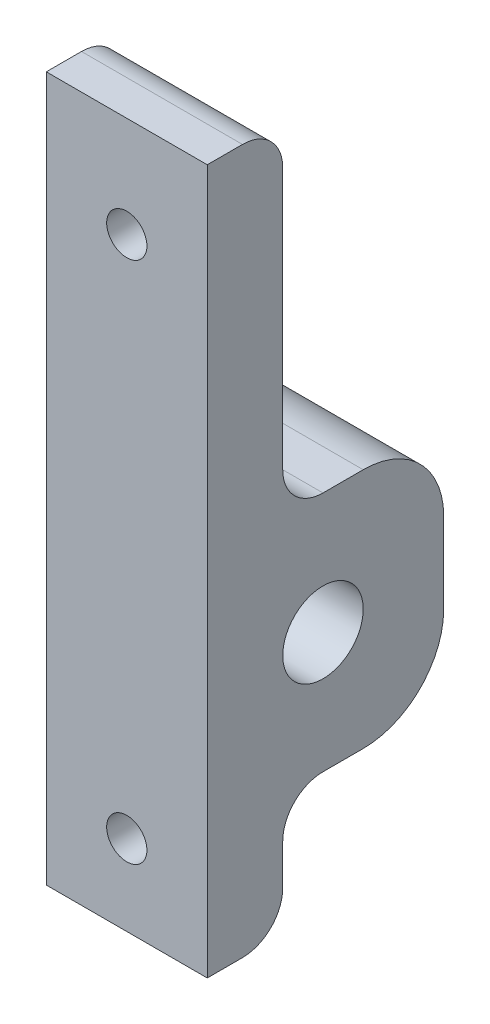
ISO-10303-21;
HEADER;
FILE_DESCRIPTION(('STEP AP214'),'2;1');
FILE_NAME('part.step','',(''),(''),'','','');
FILE_SCHEMA(('AUTOMOTIVE_DESIGN { 1 0 10303 214 1 1 1 1 }'));
ENDSEC;
DATA;
#1=APPLICATION_CONTEXT('core data for automotive mechanical design processes');
#2=APPLICATION_PROTOCOL_DEFINITION('international standard','automotive_design',2000,#1);
#3=PRODUCT_CONTEXT('',#1,'mechanical');
#4=PRODUCT('Part','Part','',(#3));
#5=PRODUCT_RELATED_PRODUCT_CATEGORY('part','',(#4));
#6=PRODUCT_DEFINITION_FORMATION('','',#4);
#7=PRODUCT_DEFINITION_CONTEXT('part definition',#1,'design');
#8=PRODUCT_DEFINITION('design','',#6,#7);
#9=PRODUCT_DEFINITION_SHAPE('','',#8);
#10=(LENGTH_UNIT() NAMED_UNIT(*) SI_UNIT(.MILLI.,.METRE.));
#11=(NAMED_UNIT(*) PLANE_ANGLE_UNIT() SI_UNIT($,.RADIAN.));
#12=(NAMED_UNIT(*) SI_UNIT($,.STERADIAN.) SOLID_ANGLE_UNIT());
#13=UNCERTAINTY_MEASURE_WITH_UNIT(LENGTH_MEASURE(1.E-05),#10,'distance_accuracy_value','');
#14=(GEOMETRIC_REPRESENTATION_CONTEXT(3) GLOBAL_UNCERTAINTY_ASSIGNED_CONTEXT((#13)) GLOBAL_UNIT_ASSIGNED_CONTEXT((#10,
#11,#12)) REPRESENTATION_CONTEXT('',''));
#15=CARTESIAN_POINT('',(0.,0.,0.));
#16=DIRECTION('',(0.,0.,1.));
#17=DIRECTION('',(1.,0.,0.));
#18=AXIS2_PLACEMENT_3D('',#15,#16,#17);
#19=CARTESIAN_POINT('',(5.00000000014378E-05,24.,-4.));
#20=DIRECTION('',(-1.,0.,0.));
#21=DIRECTION('',(0.,0.,-1.));
#22=AXIS2_PLACEMENT_3D('',#19,#20,#21);
#23=CYLINDRICAL_SURFACE('',#22,4.);
#24=CARTESIAN_POINT('',(0.,24.,-4.));
#25=DIRECTION('',(1.,0.,0.));
#26=DIRECTION('',(0.,0.,-1.));
#27=AXIS2_PLACEMENT_3D('',#24,#25,#26);
#28=CIRCLE('',#27,4.);
#29=CARTESIAN_POINT('',(0.,24.,-8.));
#30=VERTEX_POINT('',#29);
#31=EDGE_CURVE('E254',#30,#30,#28,.T.);
#32=ORIENTED_EDGE('',*,*,#31,.T.);
#33=EDGE_LOOP('',(#32));
#34=FACE_BOUND('',#33,.T.);
#35=CARTESIAN_POINT('',(-11.,24.,-4.));
#36=DIRECTION('',(1.,0.,0.));
#37=DIRECTION('',(0.,0.,-1.));
#38=AXIS2_PLACEMENT_3D('',#35,#36,#37);
#39=CIRCLE('',#38,4.);
#40=CARTESIAN_POINT('',(-11.,24.,-8.));
#41=VERTEX_POINT('',#40);
#42=EDGE_CURVE('E265',#41,#41,#39,.T.);
#43=ORIENTED_EDGE('',*,*,#42,.F.);
#44=EDGE_LOOP('',(#43));
#45=FACE_BOUND('',#44,.T.);
#46=ADVANCED_FACE('F35',(#34,#45),#23,.F.);
#47=CARTESIAN_POINT('',(-8.,8.,7.5));
#48=DIRECTION('',(0.,0.,-1.));
#49=DIRECTION('',(1.,0.,0.));
#50=AXIS2_PLACEMENT_3D('',#47,#48,#49);
#51=CYLINDRICAL_SURFACE('',#50,2.);
#52=CARTESIAN_POINT('',(-8.,8.,7.5));
#53=DIRECTION('',(0.,0.,1.));
#54=DIRECTION('',(1.,0.,0.));
#55=AXIS2_PLACEMENT_3D('',#52,#53,#54);
#56=CIRCLE('',#55,2.);
#57=CARTESIAN_POINT('',(-6.,8.,7.5));
#58=VERTEX_POINT('',#57);
#59=EDGE_CURVE('E242',#58,#58,#56,.T.);
#60=ORIENTED_EDGE('',*,*,#59,.T.);
#61=EDGE_LOOP('',(#60));
#62=FACE_BOUND('',#61,.T.);
#63=CARTESIAN_POINT('',(-8.,8.,3.5));
#64=DIRECTION('',(0.,0.,1.));
#65=DIRECTION('',(1.,0.,0.));
#66=AXIS2_PLACEMENT_3D('',#63,#64,#65);
#67=CIRCLE('',#66,2.);
#68=CARTESIAN_POINT('',(-6.,8.,3.5));
#69=VERTEX_POINT('',#68);
#70=EDGE_CURVE('E253',#69,#69,#67,.T.);
#71=ORIENTED_EDGE('',*,*,#70,.F.);
#72=EDGE_LOOP('',(#71));
#73=FACE_BOUND('',#72,.T.);
#74=ADVANCED_FACE('F275',(#62,#73),#51,.F.);
#75=CARTESIAN_POINT('',(-8.,60.,7.5));
#76=DIRECTION('',(0.,0.,-1.));
#77=DIRECTION('',(1.,0.,0.));
#78=AXIS2_PLACEMENT_3D('',#75,#76,#77);
#79=CYLINDRICAL_SURFACE('',#78,2.);
#80=CARTESIAN_POINT('',(-8.,60.,7.5));
#81=DIRECTION('',(0.,0.,1.));
#82=DIRECTION('',(1.,0.,0.));
#83=AXIS2_PLACEMENT_3D('',#80,#81,#82);
#84=CIRCLE('',#83,2.);
#85=CARTESIAN_POINT('',(-6.,60.,7.5));
#86=VERTEX_POINT('',#85);
#87=EDGE_CURVE('E232',#86,#86,#84,.T.);
#88=ORIENTED_EDGE('',*,*,#87,.T.);
#89=EDGE_LOOP('',(#88));
#90=FACE_BOUND('',#89,.T.);
#91=CARTESIAN_POINT('',(-8.,60.,3.5));
#92=DIRECTION('',(0.,0.,1.));
#93=DIRECTION('',(1.,0.,0.));
#94=AXIS2_PLACEMENT_3D('',#91,#92,#93);
#95=CIRCLE('',#94,2.);
#96=CARTESIAN_POINT('',(-6.,60.,3.5));
#97=VERTEX_POINT('',#96);
#98=EDGE_CURVE('E241',#97,#97,#95,.T.);
#99=ORIENTED_EDGE('',*,*,#98,.F.);
#100=EDGE_LOOP('',(#99));
#101=FACE_BOUND('',#100,.T.);
#102=ADVANCED_FACE('F281',(#90,#101),#79,.F.);
#103=CARTESIAN_POINT('',(0.,0.,0.));
#104=DIRECTION('',(0.,0.,-1.));
#105=DIRECTION('',(1.,0.,0.));
#106=AXIS2_PLACEMENT_3D('',#103,#104,#105);
#107=PLANE('',#106);
#108=DIRECTION('',(0.,-1.,0.));
#109=VECTOR('',#108,1.);
#110=CARTESIAN_POINT('',(0.,0.,0.));
#111=LINE('',#110,#109);
#112=CARTESIAN_POINT('',(0.,8.,0.));
#113=VERTEX_POINT('',#112);
#114=CARTESIAN_POINT('',(0.,4.,0.));
#115=VERTEX_POINT('',#114);
#116=EDGE_CURVE('E187',#113,#115,#111,.T.);
#117=ORIENTED_EDGE('',*,*,#116,.T.);
#118=DIRECTION('',(-1.,0.,0.));
#119=VECTOR('',#118,1.);
#120=CARTESIAN_POINT('',(0.,4.,0.));
#121=LINE('',#120,#119);
#122=CARTESIAN_POINT('',(-16.,4.,0.));
#123=VERTEX_POINT('',#122);
#124=EDGE_CURVE('E356',#123,#115,#121,.F.);
#125=ORIENTED_EDGE('',*,*,#124,.F.);
#126=DIRECTION('',(0.,1.,0.));
#127=VECTOR('',#126,1.);
#128=CARTESIAN_POINT('',(-16.,0.,0.));
#129=LINE('',#128,#127);
#130=CARTESIAN_POINT('',(-16.,8.,0.));
#131=VERTEX_POINT('',#130);
#132=EDGE_CURVE('E169',#123,#131,#129,.T.);
#133=ORIENTED_EDGE('',*,*,#132,.T.);
#134=DIRECTION('',(-1.,0.,0.));
#135=VECTOR('',#134,1.);
#136=CARTESIAN_POINT('',(-16.,8.,0.));
#137=LINE('',#136,#135);
#138=CARTESIAN_POINT('',(-11.5,8.,0.));
#139=VERTEX_POINT('',#138);
#140=EDGE_CURVE('E341',#139,#131,#137,.T.);
#141=ORIENTED_EDGE('',*,*,#140,.F.);
#142=CARTESIAN_POINT('',(-8.,8.,0.));
#143=DIRECTION('',(0.,0.,1.));
#144=DIRECTION('',(1.,0.,0.));
#145=AXIS2_PLACEMENT_3D('',#142,#143,#144);
#146=CIRCLE('',#145,3.5);
#147=CARTESIAN_POINT('',(-4.5,8.,0.));
#148=VERTEX_POINT('',#147);
#149=EDGE_CURVE('E250',#139,#148,#146,.T.);
#150=ORIENTED_EDGE('',*,*,#149,.T.);
#151=DIRECTION('',(-1.,0.,0.));
#152=VECTOR('',#151,1.);
#153=CARTESIAN_POINT('',(-16.,8.,0.));
#154=LINE('',#153,#152);
#155=EDGE_CURVE('E337',#113,#148,#154,.T.);
#156=ORIENTED_EDGE('',*,*,#155,.F.);
#157=EDGE_LOOP('',(#117,#125,#133,#141,#150,#156));
#158=FACE_BOUND('',#157,.T.);
#159=ADVANCED_FACE('F350',(#158),#107,.T.);
#160=CARTESIAN_POINT('',(0.,0.,7.5));
#161=DIRECTION('',(-1.,0.,0.));
#162=DIRECTION('',(0.,0.,-1.));
#163=AXIS2_PLACEMENT_3D('',#160,#161,#162);
#164=PLANE('',#163);
#165=ORIENTED_EDGE('',*,*,#31,.F.);
#166=EDGE_LOOP('',(#165));
#167=FACE_BOUND('',#166,.T.);
#168=DIRECTION('',(0.,0.,1.));
#169=VECTOR('',#168,1.);
#170=CARTESIAN_POINT('',(0.,36.,-16.));
#171=LINE('',#170,#169);
#172=CARTESIAN_POINT('',(0.,36.,-8.));
#173=VERTEX_POINT('',#172);
#174=CARTESIAN_POINT('',(0.,36.,-4.));
#175=VERTEX_POINT('',#174);
#176=EDGE_CURVE('E211',#173,#175,#171,.T.);
#177=ORIENTED_EDGE('',*,*,#176,.T.);
#178=CARTESIAN_POINT('',(0.,40.,-4.));
#179=DIRECTION('',(1.,0.,0.));
#180=DIRECTION('',(0.,0.,-1.));
#181=AXIS2_PLACEMENT_3D('',#178,#179,#180);
#182=CIRCLE('',#181,4.);
#183=CARTESIAN_POINT('',(0.,40.,0.));
#184=VERTEX_POINT('',#183);
#185=EDGE_CURVE('E307',#184,#175,#182,.T.);
#186=ORIENTED_EDGE('',*,*,#185,.F.);
#187=CARTESIAN_POINT('',(0.,66.,0.));
#188=VERTEX_POINT('',#187);
#189=EDGE_CURVE('E190',#188,#184,#111,.T.);
#190=ORIENTED_EDGE('',*,*,#189,.F.);
#191=CARTESIAN_POINT('',(0.,66.,4.));
#192=DIRECTION('',(1.,0.,0.));
#193=DIRECTION('',(0.,0.,-1.));
#194=AXIS2_PLACEMENT_3D('',#191,#192,#193);
#195=CIRCLE('',#194,4.);
#196=CARTESIAN_POINT('',(0.,70.,4.));
#197=VERTEX_POINT('',#196);
#198=EDGE_CURVE('E355',#197,#188,#195,.F.);
#199=ORIENTED_EDGE('',*,*,#198,.F.);
#200=DIRECTION('',(0.,0.,-1.));
#201=VECTOR('',#200,1.);
#202=CARTESIAN_POINT('',(0.,70.,7.5));
#203=LINE('',#202,#201);
#204=CARTESIAN_POINT('',(0.,70.,7.5));
#205=VERTEX_POINT('',#204);
#206=EDGE_CURVE('E168',#205,#197,#203,.T.);
#207=ORIENTED_EDGE('',*,*,#206,.F.);
#208=DIRECTION('',(0.,-1.,0.));
#209=VECTOR('',#208,1.);
#210=CARTESIAN_POINT('',(0.,0.,7.5));
#211=LINE('',#210,#209);
#212=CARTESIAN_POINT('',(0.,0.,7.5));
#213=VERTEX_POINT('',#212);
#214=EDGE_CURVE('E146',#205,#213,#211,.T.);
#215=ORIENTED_EDGE('',*,*,#214,.T.);
#216=DIRECTION('',(0.,0.,-1.));
#217=VECTOR('',#216,1.);
#218=CARTESIAN_POINT('',(0.,0.,7.5));
#219=LINE('',#218,#217);
#220=CARTESIAN_POINT('',(0.,0.,4.));
#221=VERTEX_POINT('',#220);
#222=EDGE_CURVE('E155',#213,#221,#219,.T.);
#223=ORIENTED_EDGE('',*,*,#222,.T.);
#224=CARTESIAN_POINT('',(0.,4.,4.));
#225=DIRECTION('',(1.,0.,0.));
#226=DIRECTION('',(0.,0.,-1.));
#227=AXIS2_PLACEMENT_3D('',#224,#225,#226);
#228=CIRCLE('',#227,4.);
#229=EDGE_CURVE('E194',#115,#221,#228,.F.);
#230=ORIENTED_EDGE('',*,*,#229,.F.);
#231=ORIENTED_EDGE('',*,*,#116,.F.);
#232=CARTESIAN_POINT('',(0.,8.,-4.));
#233=DIRECTION('',(1.,0.,0.));
#234=DIRECTION('',(0.,0.,-1.));
#235=AXIS2_PLACEMENT_3D('',#232,#233,#234);
#236=CIRCLE('',#235,4.);
#237=CARTESIAN_POINT('',(0.,12.,-4.));
#238=VERTEX_POINT('',#237);
#239=EDGE_CURVE('E332',#238,#113,#236,.T.);
#240=ORIENTED_EDGE('',*,*,#239,.F.);
#241=DIRECTION('',(0.,0.,1.));
#242=VECTOR('',#241,1.);
#243=CARTESIAN_POINT('',(0.,12.,-16.));
#244=LINE('',#243,#242);
#245=CARTESIAN_POINT('',(0.,12.,-8.));
#246=VERTEX_POINT('',#245);
#247=EDGE_CURVE('E205',#246,#238,#244,.T.);
#248=ORIENTED_EDGE('',*,*,#247,.F.);
#249=CARTESIAN_POINT('',(0.,20.,-8.));
#250=DIRECTION('',(1.,0.,0.));
#251=DIRECTION('',(0.,0.,-1.));
#252=AXIS2_PLACEMENT_3D('',#249,#250,#251);
#253=CIRCLE('',#252,8.);
#254=CARTESIAN_POINT('',(0.,20.,-16.));
#255=VERTEX_POINT('',#254);
#256=EDGE_CURVE('E221',#255,#246,#253,.F.);
#257=ORIENTED_EDGE('',*,*,#256,.F.);
#258=DIRECTION('',(0.,1.,0.));
#259=VECTOR('',#258,1.);
#260=CARTESIAN_POINT('',(0.,0.,-16.));
#261=LINE('',#260,#259);
#262=CARTESIAN_POINT('',(0.,28.,-16.));
#263=VERTEX_POINT('',#262);
#264=EDGE_CURVE('E229',#255,#263,#261,.T.);
#265=ORIENTED_EDGE('',*,*,#264,.T.);
#266=CARTESIAN_POINT('',(0.,28.,-8.));
#267=DIRECTION('',(1.,0.,0.));
#268=DIRECTION('',(0.,0.,-1.));
#269=AXIS2_PLACEMENT_3D('',#266,#267,#268);
#270=CIRCLE('',#269,8.);
#271=EDGE_CURVE('E43',#173,#263,#270,.F.);
#272=ORIENTED_EDGE('',*,*,#271,.F.);
#273=EDGE_LOOP('',(#177,#186,#190,#199,#207,#215,#223,#230,#231,#240,#248,#257,#265,#272));
#274=FACE_BOUND('',#273,.T.);
#275=ADVANCED_FACE('F165',(#167,#274),#164,.F.);
#276=CARTESIAN_POINT('',(0.,0.,7.5));
#277=DIRECTION('',(0.,1.,0.));
#278=DIRECTION('',(0.,0.,1.));
#279=AXIS2_PLACEMENT_3D('',#276,#277,#278);
#280=PLANE('',#279);
#281=ORIENTED_EDGE('',*,*,#222,.F.);
#282=DIRECTION('',(-1.,0.,0.));
#283=VECTOR('',#282,1.);
#284=CARTESIAN_POINT('',(0.,0.,7.5));
#285=LINE('',#284,#283);
#286=CARTESIAN_POINT('',(-16.,0.,7.5));
#287=VERTEX_POINT('',#286);
#288=EDGE_CURVE('E142',#213,#287,#285,.T.);
#289=ORIENTED_EDGE('',*,*,#288,.T.);
#290=DIRECTION('',(0.,0.,-1.));
#291=VECTOR('',#290,1.);
#292=CARTESIAN_POINT('',(-16.,0.,7.5));
#293=LINE('',#292,#291);
#294=CARTESIAN_POINT('',(-16.,0.,4.));
#295=VERTEX_POINT('',#294);
#296=EDGE_CURVE('E162',#287,#295,#293,.T.);
#297=ORIENTED_EDGE('',*,*,#296,.T.);
#298=DIRECTION('',(-1.,0.,0.));
#299=VECTOR('',#298,1.);
#300=CARTESIAN_POINT('',(-16.,0.,4.));
#301=LINE('',#300,#299);
#302=EDGE_CURVE('E158',#221,#295,#301,.T.);
#303=ORIENTED_EDGE('',*,*,#302,.F.);
#304=EDGE_LOOP('',(#281,#289,#297,#303));
#305=FACE_BOUND('',#304,.T.);
#306=ADVANCED_FACE('F156',(#305),#280,.F.);
#307=CARTESIAN_POINT('',(-16.,0.,7.5));
#308=DIRECTION('',(1.,0.,0.));
#309=DIRECTION('',(0.,0.,1.));
#310=AXIS2_PLACEMENT_3D('',#307,#308,#309);
#311=PLANE('',#310);
#312=CARTESIAN_POINT('',(-16.,24.,-4.));
#313=DIRECTION('',(1.,0.,0.));
#314=DIRECTION('',(0.,0.,-1.));
#315=AXIS2_PLACEMENT_3D('',#312,#313,#314);
#316=CIRCLE('',#315,8.);
#317=CARTESIAN_POINT('',(-16.,24.,-12.));
#318=VERTEX_POINT('',#317);
#319=EDGE_CURVE('E262',#318,#318,#316,.T.);
#320=ORIENTED_EDGE('',*,*,#319,.T.);
#321=EDGE_LOOP('',(#320));
#322=FACE_BOUND('',#321,.T.);
#323=DIRECTION('',(0.,-1.,0.));
#324=VECTOR('',#323,1.);
#325=CARTESIAN_POINT('',(-16.,0.,-16.));
#326=LINE('',#325,#324);
#327=CARTESIAN_POINT('',(-16.,28.,-16.));
#328=VERTEX_POINT('',#327);
#329=CARTESIAN_POINT('',(-16.,20.,-16.));
#330=VERTEX_POINT('',#329);
#331=EDGE_CURVE('E175',#328,#330,#326,.T.);
#332=ORIENTED_EDGE('',*,*,#331,.T.);
#333=CARTESIAN_POINT('',(-16.,20.,-8.));
#334=DIRECTION('',(-1.,0.,0.));
#335=DIRECTION('',(0.,0.,1.));
#336=AXIS2_PLACEMENT_3D('',#333,#334,#335);
#337=CIRCLE('',#336,8.);
#338=CARTESIAN_POINT('',(-16.,12.,-8.));
#339=VERTEX_POINT('',#338);
#340=EDGE_CURVE('E212',#339,#330,#337,.F.);
#341=ORIENTED_EDGE('',*,*,#340,.F.);
#342=DIRECTION('',(0.,0.,1.));
#343=VECTOR('',#342,1.);
#344=CARTESIAN_POINT('',(-16.,12.,-16.));
#345=LINE('',#344,#343);
#346=CARTESIAN_POINT('',(-16.,12.,-4.));
#347=VERTEX_POINT('',#346);
#348=EDGE_CURVE('E200',#339,#347,#345,.T.);
#349=ORIENTED_EDGE('',*,*,#348,.T.);
#350=CARTESIAN_POINT('',(-16.,8.,-4.));
#351=DIRECTION('',(-1.,0.,0.));
#352=DIRECTION('',(0.,0.,1.));
#353=AXIS2_PLACEMENT_3D('',#350,#351,#352);
#354=CIRCLE('',#353,4.);
#355=EDGE_CURVE('E306',#131,#347,#354,.T.);
#356=ORIENTED_EDGE('',*,*,#355,.F.);
#357=ORIENTED_EDGE('',*,*,#132,.F.);
#358=CARTESIAN_POINT('',(-16.,4.,4.));
#359=DIRECTION('',(-1.,0.,0.));
#360=DIRECTION('',(0.,0.,1.));
#361=AXIS2_PLACEMENT_3D('',#358,#359,#360);
#362=CIRCLE('',#361,4.);
#363=EDGE_CURVE('E357',#295,#123,#362,.F.);
#364=ORIENTED_EDGE('',*,*,#363,.F.);
#365=ORIENTED_EDGE('',*,*,#296,.F.);
#366=DIRECTION('',(0.,1.,0.));
#367=VECTOR('',#366,1.);
#368=CARTESIAN_POINT('',(-16.,0.,7.5));
#369=LINE('',#368,#367);
#370=CARTESIAN_POINT('',(-16.,70.,7.5));
#371=VERTEX_POINT('',#370);
#372=EDGE_CURVE('E149',#287,#371,#369,.T.);
#373=ORIENTED_EDGE('',*,*,#372,.T.);
#374=DIRECTION('',(0.,0.,-1.));
#375=VECTOR('',#374,1.);
#376=CARTESIAN_POINT('',(-16.,70.,7.5));
#377=LINE('',#376,#375);
#378=CARTESIAN_POINT('',(-16.,70.,4.));
#379=VERTEX_POINT('',#378);
#380=EDGE_CURVE('E392',#371,#379,#377,.T.);
#381=ORIENTED_EDGE('',*,*,#380,.T.);
#382=CARTESIAN_POINT('',(-16.,66.,4.));
#383=DIRECTION('',(-1.,0.,0.));
#384=DIRECTION('',(0.,0.,1.));
#385=AXIS2_PLACEMENT_3D('',#382,#383,#384);
#386=CIRCLE('',#385,4.);
#387=CARTESIAN_POINT('',(-16.,66.,0.));
#388=VERTEX_POINT('',#387);
#389=EDGE_CURVE('E361',#388,#379,#386,.F.);
#390=ORIENTED_EDGE('',*,*,#389,.F.);
#391=CARTESIAN_POINT('',(-16.,40.,0.));
#392=VERTEX_POINT('',#391);
#393=EDGE_CURVE('E172',#392,#388,#129,.T.);
#394=ORIENTED_EDGE('',*,*,#393,.F.);
#395=CARTESIAN_POINT('',(-16.,40.,-4.));
#396=DIRECTION('',(-1.,0.,0.));
#397=DIRECTION('',(0.,0.,1.));
#398=AXIS2_PLACEMENT_3D('',#395,#396,#397);
#399=CIRCLE('',#398,4.);
#400=CARTESIAN_POINT('',(-16.,36.,-4.));
#401=VERTEX_POINT('',#400);
#402=EDGE_CURVE('E365',#401,#392,#399,.T.);
#403=ORIENTED_EDGE('',*,*,#402,.F.);
#404=DIRECTION('',(0.,0.,1.));
#405=VECTOR('',#404,1.);
#406=CARTESIAN_POINT('',(-16.,36.,-16.));
#407=LINE('',#406,#405);
#408=CARTESIAN_POINT('',(-16.,36.,-8.));
#409=VERTEX_POINT('',#408);
#410=EDGE_CURVE('E204',#409,#401,#407,.T.);
#411=ORIENTED_EDGE('',*,*,#410,.F.);
#412=CARTESIAN_POINT('',(-16.,28.,-8.));
#413=DIRECTION('',(-1.,0.,0.));
#414=DIRECTION('',(0.,0.,1.));
#415=AXIS2_PLACEMENT_3D('',#412,#413,#414);
#416=CIRCLE('',#415,8.);
#417=EDGE_CURVE('E219',#328,#409,#416,.F.);
#418=ORIENTED_EDGE('',*,*,#417,.F.);
#419=EDGE_LOOP('',(#332,#341,#349,#356,#357,#364,#365,#373,#381,#390,#394,#403,#411,#418));
#420=FACE_BOUND('',#419,.T.);
#421=ADVANCED_FACE('F344',(#322,#420),#311,.F.);
#422=CARTESIAN_POINT('',(0.,70.,7.5));
#423=DIRECTION('',(0.,-1.,0.));
#424=DIRECTION('',(0.,0.,-1.));
#425=AXIS2_PLACEMENT_3D('',#422,#423,#424);
#426=PLANE('',#425);
#427=ORIENTED_EDGE('',*,*,#380,.F.);
#428=DIRECTION('',(1.,0.,0.));
#429=VECTOR('',#428,1.);
#430=CARTESIAN_POINT('',(0.,70.,7.5));
#431=LINE('',#430,#429);
#432=EDGE_CURVE('E179',#371,#205,#431,.T.);
#433=ORIENTED_EDGE('',*,*,#432,.T.);
#434=ORIENTED_EDGE('',*,*,#206,.T.);
#435=DIRECTION('',(1.,0.,0.));
#436=VECTOR('',#435,1.);
#437=CARTESIAN_POINT('',(0.,70.,4.));
#438=LINE('',#437,#436);
#439=EDGE_CURVE('E161',#379,#197,#438,.T.);
#440=ORIENTED_EDGE('',*,*,#439,.F.);
#441=EDGE_LOOP('',(#427,#433,#434,#440));
#442=FACE_BOUND('',#441,.T.);
#443=ADVANCED_FACE('F395',(#442),#426,.F.);
#444=CARTESIAN_POINT('',(0.,0.,7.5));
#445=DIRECTION('',(0.,0.,-1.));
#446=DIRECTION('',(1.,0.,0.));
#447=AXIS2_PLACEMENT_3D('',#444,#445,#446);
#448=PLANE('',#447);
#449=ORIENTED_EDGE('',*,*,#59,.F.);
#450=EDGE_LOOP('',(#449));
#451=FACE_BOUND('',#450,.T.);
#452=ORIENTED_EDGE('',*,*,#87,.F.);
#453=EDGE_LOOP('',(#452));
#454=FACE_BOUND('',#453,.T.);
#455=ORIENTED_EDGE('',*,*,#214,.F.);
#456=ORIENTED_EDGE('',*,*,#432,.F.);
#457=ORIENTED_EDGE('',*,*,#372,.F.);
#458=ORIENTED_EDGE('',*,*,#288,.F.);
#459=EDGE_LOOP('',(#455,#456,#457,#458));
#460=FACE_BOUND('',#459,.T.);
#461=ADVANCED_FACE('F144',(#451,#454,#460),#448,.F.);
#462=CARTESIAN_POINT('',(-8.,60.,0.));
#463=DIRECTION('',(0.,0.,1.));
#464=DIRECTION('',(1.,0.,0.));
#465=AXIS2_PLACEMENT_3D('',#462,#463,#464);
#466=CIRCLE('',#465,3.5);
#467=CARTESIAN_POINT('',(-4.5,60.,0.));
#468=VERTEX_POINT('',#467);
#469=EDGE_CURVE('E238',#468,#468,#466,.T.);
#470=ORIENTED_EDGE('',*,*,#469,.T.);
#471=EDGE_LOOP('',(#470));
#472=FACE_BOUND('',#471,.T.);
#473=ORIENTED_EDGE('',*,*,#189,.T.);
#474=DIRECTION('',(-1.,0.,0.));
#475=VECTOR('',#474,1.);
#476=CARTESIAN_POINT('',(0.,40.,0.));
#477=LINE('',#476,#475);
#478=EDGE_CURVE('E372',#392,#184,#477,.F.);
#479=ORIENTED_EDGE('',*,*,#478,.F.);
#480=ORIENTED_EDGE('',*,*,#393,.T.);
#481=DIRECTION('',(1.,0.,0.));
#482=VECTOR('',#481,1.);
#483=CARTESIAN_POINT('',(-16.,66.,0.));
#484=LINE('',#483,#482);
#485=EDGE_CURVE('E386',#188,#388,#484,.F.);
#486=ORIENTED_EDGE('',*,*,#485,.F.);
#487=EDGE_LOOP('',(#473,#479,#480,#486));
#488=FACE_BOUND('',#487,.T.);
#489=ADVANCED_FACE('F396',(#472,#488),#107,.T.);
#490=CARTESIAN_POINT('',(0.,36.,-16.));
#491=DIRECTION('',(0.,-1.,0.));
#492=DIRECTION('',(-1.,0.,0.));
#493=AXIS2_PLACEMENT_3D('',#490,#491,#492);
#494=PLANE('',#493);
#495=ORIENTED_EDGE('',*,*,#410,.T.);
#496=DIRECTION('',(-1.,0.,0.));
#497=VECTOR('',#496,1.);
#498=CARTESIAN_POINT('',(0.,36.,-4.));
#499=LINE('',#498,#497);
#500=EDGE_CURVE('E358',#175,#401,#499,.T.);
#501=ORIENTED_EDGE('',*,*,#500,.F.);
#502=ORIENTED_EDGE('',*,*,#176,.F.);
#503=DIRECTION('',(-1.,0.,0.));
#504=VECTOR('',#503,1.);
#505=CARTESIAN_POINT('',(0.,36.,-8.));
#506=LINE('',#505,#504);
#507=EDGE_CURVE('E56',#409,#173,#506,.F.);
#508=ORIENTED_EDGE('',*,*,#507,.F.);
#509=EDGE_LOOP('',(#495,#501,#502,#508));
#510=FACE_BOUND('',#509,.T.);
#511=ADVANCED_FACE('F375',(#510),#494,.F.);
#512=CARTESIAN_POINT('',(0.,12.,-16.));
#513=DIRECTION('',(0.,-1.,0.));
#514=DIRECTION('',(0.,0.,-1.));
#515=AXIS2_PLACEMENT_3D('',#512,#513,#514);
#516=PLANE('',#515);
#517=ORIENTED_EDGE('',*,*,#247,.T.);
#518=DIRECTION('',(-1.,0.,0.));
#519=VECTOR('',#518,1.);
#520=CARTESIAN_POINT('',(0.,12.,-4.));
#521=LINE('',#520,#519);
#522=EDGE_CURVE('E334',#347,#238,#521,.F.);
#523=ORIENTED_EDGE('',*,*,#522,.F.);
#524=ORIENTED_EDGE('',*,*,#348,.F.);
#525=DIRECTION('',(-1.,0.,0.));
#526=VECTOR('',#525,1.);
#527=CARTESIAN_POINT('',(0.,12.,-8.));
#528=LINE('',#527,#526);
#529=EDGE_CURVE('E11',#246,#339,#528,.T.);
#530=ORIENTED_EDGE('',*,*,#529,.F.);
#531=EDGE_LOOP('',(#517,#523,#524,#530));
#532=FACE_BOUND('',#531,.T.);
#533=ADVANCED_FACE('F333',(#532),#516,.T.);
#534=CARTESIAN_POINT('',(0.,0.,-16.));
#535=DIRECTION('',(0.,0.,-1.));
#536=DIRECTION('',(1.,0.,0.));
#537=AXIS2_PLACEMENT_3D('',#534,#535,#536);
#538=PLANE('',#537);
#539=ORIENTED_EDGE('',*,*,#264,.F.);
#540=DIRECTION('',(-1.,0.,0.));
#541=VECTOR('',#540,1.);
#542=CARTESIAN_POINT('',(0.,20.,-16.));
#543=LINE('',#542,#541);
#544=EDGE_CURVE('E329',#330,#255,#543,.F.);
#545=ORIENTED_EDGE('',*,*,#544,.F.);
#546=ORIENTED_EDGE('',*,*,#331,.F.);
#547=DIRECTION('',(-1.,0.,0.));
#548=VECTOR('',#547,1.);
#549=CARTESIAN_POINT('',(-16.,28.,-16.));
#550=LINE('',#549,#548);
#551=EDGE_CURVE('E206',#263,#328,#550,.T.);
#552=ORIENTED_EDGE('',*,*,#551,.F.);
#553=EDGE_LOOP('',(#539,#545,#546,#552));
#554=FACE_BOUND('',#553,.T.);
#555=ADVANCED_FACE('F423',(#554),#538,.T.);
#556=CARTESIAN_POINT('',(-8.,60.,3.5));
#557=DIRECTION('',(0.,0.,-1.));
#558=DIRECTION('',(1.,0.,0.));
#559=AXIS2_PLACEMENT_3D('',#556,#557,#558);
#560=CYLINDRICAL_SURFACE('',#559,3.5);
#561=CARTESIAN_POINT('',(-8.,60.,3.5));
#562=DIRECTION('',(0.,0.,1.));
#563=DIRECTION('',(1.,0.,0.));
#564=AXIS2_PLACEMENT_3D('',#561,#562,#563);
#565=CIRCLE('',#564,3.5);
#566=CARTESIAN_POINT('',(-4.5,60.,3.5));
#567=VERTEX_POINT('',#566);
#568=EDGE_CURVE('E235',#567,#567,#565,.T.);
#569=ORIENTED_EDGE('',*,*,#568,.T.);
#570=EDGE_LOOP('',(#569));
#571=FACE_BOUND('',#570,.T.);
#572=ORIENTED_EDGE('',*,*,#469,.F.);
#573=EDGE_LOOP('',(#572));
#574=FACE_BOUND('',#573,.T.);
#575=ADVANCED_FACE('F422',(#571,#574),#560,.F.);
#576=CARTESIAN_POINT('',(0.,0.,3.5));
#577=DIRECTION('',(0.,0.,-1.));
#578=DIRECTION('',(1.,0.,0.));
#579=AXIS2_PLACEMENT_3D('',#576,#577,#578);
#580=PLANE('',#579);
#581=ORIENTED_EDGE('',*,*,#98,.T.);
#582=EDGE_LOOP('',(#581));
#583=FACE_BOUND('',#582,.T.);
#584=ORIENTED_EDGE('',*,*,#568,.F.);
#585=EDGE_LOOP('',(#584));
#586=FACE_BOUND('',#585,.T.);
#587=ADVANCED_FACE('F295',(#583,#586),#580,.T.);
#588=CARTESIAN_POINT('',(-8.,8.,3.5));
#589=DIRECTION('',(0.,0.,-1.));
#590=DIRECTION('',(1.,0.,0.));
#591=AXIS2_PLACEMENT_3D('',#588,#589,#590);
#592=CYLINDRICAL_SURFACE('',#591,3.5);
#593=CARTESIAN_POINT('',(-8.,8.,3.5));
#594=DIRECTION('',(0.,0.,1.));
#595=DIRECTION('',(1.,0.,0.));
#596=AXIS2_PLACEMENT_3D('',#593,#594,#595);
#597=CIRCLE('',#596,3.5);
#598=CARTESIAN_POINT('',(-4.5,8.,3.5));
#599=VERTEX_POINT('',#598);
#600=EDGE_CURVE('E249',#599,#599,#597,.T.);
#601=ORIENTED_EDGE('',*,*,#600,.T.);
#602=EDGE_LOOP('',(#601));
#603=FACE_BOUND('',#602,.T.);
#604=ORIENTED_EDGE('',*,*,#149,.F.);
#605=CARTESIAN_POINT('',(-4.5,8.,0.));
#606=CARTESIAN_POINT('',(-4.49998083245088,8.08230450378956,1.98449583920335E-05));
#607=CARTESIAN_POINT('',(-4.50290250012557,8.16459413820771,-0.00253961710839599));
#608=CARTESIAN_POINT('',(-4.51447935650005,8.32840070905771,-0.0126650727012386));
#609=CARTESIAN_POINT('',(-4.5231303694743,8.40991816442127,-0.0202274199641486));
#610=CARTESIAN_POINT('',(-4.54592713590337,8.57091639705323,-0.0401275099853257));
#611=CARTESIAN_POINT('',(-4.5600286366645,8.65040821679425,-0.052426790623289));
#612=CARTESIAN_POINT('',(-4.59346065681827,8.80742961651992,-0.0815253545269562));
#613=CARTESIAN_POINT('',(-4.61279186710942,8.88495893575704,-0.0983252323650644));
#614=CARTESIAN_POINT('',(-4.67806204606507,9.11341915319808,-0.154900340755004));
#615=CARTESIAN_POINT('',(-4.73136186904547,9.26079606607341,-0.200925361562219));
#616=CARTESIAN_POINT('',(-4.85476859144237,9.5431793268219,-0.306563543115235));
#617=CARTESIAN_POINT('',(-4.92490951909559,9.67815985386948,-0.366204202737227));
#618=CARTESIAN_POINT('',(-5.10913717718041,9.98390520496888,-0.520969156185693));
#619=CARTESIAN_POINT('',(-5.22973475518223,10.1483610593085,-0.620902345890295));
#620=CARTESIAN_POINT('',(-5.42668403436855,10.3744692072258,-0.779679651091281));
#621=CARTESIAN_POINT('',(-5.49513650634117,10.4465118632306,-0.834183040279276));
#622=CARTESIAN_POINT('',(-5.6370221707569,10.583808292118,-0.94521577085513));
#623=CARTESIAN_POINT('',(-5.71045361532535,10.6490644272419,-1.00174439802761));
#624=CARTESIAN_POINT('',(-5.8636758801819,10.7741887658801,-1.11707133509295));
#625=CARTESIAN_POINT('',(-5.94357053176018,10.8339082536504,-1.17589225351757));
#626=CARTESIAN_POINT('',(-6.10823638712412,10.946383382205,-1.2934451638072));
#627=CARTESIAN_POINT('',(-6.19300911634637,10.999136827441,-1.35217712189562));
#628=CARTESIAN_POINT('',(-6.36739530919963,11.097516541931,-1.46797560880048));
#629=CARTESIAN_POINT('',(-6.45699890762328,11.1431566469455,-1.52504519057035));
#630=CARTESIAN_POINT('',(-6.64153281736212,11.2272029860491,-1.63568646010398));
#631=CARTESIAN_POINT('',(-6.73645900593102,11.2656147212723,-1.68926078746958));
#632=CARTESIAN_POINT('',(-6.93519673917974,11.3358111112173,-1.79175926666812));
#633=CARTESIAN_POINT('',(-7.03918855708637,11.3673647524893,-1.84049778136843));
#634=CARTESIAN_POINT('',(-7.25386641259924,11.4213272296068,-1.92704889448669));
#635=CARTESIAN_POINT('',(-7.36453913307431,11.4437536100172,-1.96488241340064));
#636=CARTESIAN_POINT('',(-7.57440220590184,11.4753848995296,-2.01945546951916));
#637=CARTESIAN_POINT('',(-7.67272703067878,11.4860965838959,-2.03855000654159));
#638=CARTESIAN_POINT('',(-7.87163191190862,11.499058485374,-2.06175659642819));
#639=CARTESIAN_POINT('',(-7.97220815526127,11.5013220592352,-2.06589229939721));
#640=CARTESIAN_POINT('',(-8.17256361885712,11.4971807188466,-2.05841952121536));
#641=CARTESIAN_POINT('',(-8.2723427879374,11.4907752525712,-2.0468100374455));
#642=CARTESIAN_POINT('',(-8.46853448908381,11.4699072584047,-2.00998074673161));
#643=CARTESIAN_POINT('',(-8.56493987124242,11.4554286046578,-1.98473370249322));
#644=CARTESIAN_POINT('',(-8.80977305460053,11.4085012601218,-1.90590300082563));
#645=CARTESIAN_POINT('',(-8.9545111761888,11.3704811636703,-1.84441259359423));
#646=CARTESIAN_POINT('',(-9.23243147547353,11.2791265556614,-1.70781071571506));
#647=CARTESIAN_POINT('',(-9.36556230917687,11.225728093932,-1.63264285886086));
#648=CARTESIAN_POINT('',(-9.59638236936993,11.1168012351196,-1.4916340825688));
#649=CARTESIAN_POINT('',(-9.69590629378285,11.0637382188863,-1.42684972690485));
#650=CARTESIAN_POINT('',(-9.88878076065059,10.948750345378,-1.2958421274068));
#651=CARTESIAN_POINT('',(-9.982127798961,10.8868205199288,-1.22961809466866));
#652=CARTESIAN_POINT('',(-10.1625980350742,10.7542119921838,-1.09775004733593));
#653=CARTESIAN_POINT('',(-10.2497288336928,10.6835442735139,-1.03210541348769));
#654=CARTESIAN_POINT('',(-10.4176367338179,10.5333224740096,-0.902888292703438));
#655=CARTESIAN_POINT('',(-10.4984132762748,10.4537676127681,-0.839315988379217));
#656=CARTESIAN_POINT('',(-10.6952142810142,10.2398564922304,-0.682018228711527));
#657=CARTESIAN_POINT('',(-10.8065062840367,10.0992330129875,-0.590704749969204));
#658=CARTESIAN_POINT('',(-11.0090576500919,9.79681838287674,-0.422108135393273));
#659=CARTESIAN_POINT('',(-11.1003487440522,9.63506142030161,-0.344802810180385));
#660=CARTESIAN_POINT('',(-11.2433069488187,9.32454827105247,-0.222707456445713));
#661=CARTESIAN_POINT('',(-11.2991983966515,9.17907979605379,-0.174535778489016));
#662=CARTESIAN_POINT('',(-11.3917268465863,8.87798603235536,-0.0944564846724877));
#663=CARTESIAN_POINT('',(-11.4284015073974,8.72238128576349,-0.0625170625471835));
#664=CARTESIAN_POINT('',(-11.4693972475288,8.47127403913222,-0.026756302371768));
#665=CARTESIAN_POINT('',(-11.4808317174053,8.37773823028018,-0.0167642517251708));
#666=CARTESIAN_POINT('',(-11.4961483758328,8.18949087571369,-0.0033703835576169));
#667=CARTESIAN_POINT('',(-11.500022927906,8.09477823831043,2.47702444901465E-05));
#668=CARTESIAN_POINT('',(-11.5,8.,0.));
#669=B_SPLINE_CURVE_WITH_KNOTS('',3,(#605,#606,#607,#608,#609,#610,#611,#612,#613,#614,#615,
#616,#617,#618,#619,#620,#621,#622,#623,#624,#625,#626,#627,#628,#629,#630,#631,#632,#633,#634,
#635,#636,#637,#638,#639,#640,#641,#642,#643,#644,#645,#646,#647,#648,#649,#650,#651,#652,#653,
#654,#655,#656,#657,#658,#659,#660,#661,#662,#663,#664,#665,#666,#667,#668),.UNSPECIFIED.,.F.,
.F.,(4,2,2,2,2,2,2,2,2,2,2,2,2,2,2,2,2,2,2,2,2,2,2,2,2,2,2,2,2,2,2,4),(0.,0.246797643477059,
0.493415610793791,0.738071969519795,0.982760665668909,1.4704071526543,1.95904736890605,
2.63637517393178,2.9761707121711,3.31584757624414,3.66293956389186,4.01014068775638,
4.35665782768139,4.70291017546745,5.05945813082297,5.41531744976149,5.71623148788964,
6.01666956867305,6.31712678159345,6.61818630637863,7.1008097167772,7.58546981139668,
7.97520888300086,8.36516719071213,8.75464020700297,9.14414745103336,9.74556617574774,
10.3460237427331,10.8334106519001,11.3198388335457,11.6036265031259,11.8877006862257),.UNSPECIFIED.);
#670=EDGE_CURVE('E299',#148,#139,#669,.T.);
#671=ORIENTED_EDGE('',*,*,#670,.F.);
#672=EDGE_LOOP('',(#604,#671));
#673=FACE_BOUND('',#672,.T.);
#674=ADVANCED_FACE('F291',(#603,#673),#592,.F.);
#675=CARTESIAN_POINT('',(0.,0.,3.5));
#676=DIRECTION('',(0.,0.,-1.));
#677=DIRECTION('',(1.,0.,0.));
#678=AXIS2_PLACEMENT_3D('',#675,#676,#677);
#679=PLANE('',#678);
#680=ORIENTED_EDGE('',*,*,#70,.T.);
#681=EDGE_LOOP('',(#680));
#682=FACE_BOUND('',#681,.T.);
#683=ORIENTED_EDGE('',*,*,#600,.F.);
#684=EDGE_LOOP('',(#683));
#685=FACE_BOUND('',#684,.T.);
#686=ADVANCED_FACE('F288',(#682,#685),#679,.T.);
#687=CARTESIAN_POINT('',(-11.,24.,-4.));
#688=DIRECTION('',(-1.,0.,0.));
#689=DIRECTION('',(0.,0.,-1.));
#690=AXIS2_PLACEMENT_3D('',#687,#688,#689);
#691=CYLINDRICAL_SURFACE('',#690,8.);
#692=CARTESIAN_POINT('',(-11.,24.,-4.));
#693=DIRECTION('',(1.,0.,0.));
#694=DIRECTION('',(0.,0.,-1.));
#695=AXIS2_PLACEMENT_3D('',#692,#693,#694);
#696=CIRCLE('',#695,8.);
#697=CARTESIAN_POINT('',(-11.,24.,-12.));
#698=VERTEX_POINT('',#697);
#699=EDGE_CURVE('E261',#698,#698,#696,.T.);
#700=ORIENTED_EDGE('',*,*,#699,.T.);
#701=EDGE_LOOP('',(#700));
#702=FACE_BOUND('',#701,.T.);
#703=ORIENTED_EDGE('',*,*,#319,.F.);
#704=EDGE_LOOP('',(#703));
#705=FACE_BOUND('',#704,.T.);
#706=ADVANCED_FACE('F286',(#702,#705),#691,.F.);
#707=CARTESIAN_POINT('',(-11.,0.,0.));
#708=DIRECTION('',(-1.,0.,0.));
#709=DIRECTION('',(0.,0.,-1.));
#710=AXIS2_PLACEMENT_3D('',#707,#708,#709);
#711=PLANE('',#710);
#712=ORIENTED_EDGE('',*,*,#42,.T.);
#713=EDGE_LOOP('',(#712));
#714=FACE_BOUND('',#713,.T.);
#715=ORIENTED_EDGE('',*,*,#699,.F.);
#716=EDGE_LOOP('',(#715));
#717=FACE_BOUND('',#716,.T.);
#718=ADVANCED_FACE('F271',(#714,#717),#711,.T.);
#719=CARTESIAN_POINT('',(0.,66.,4.));
#720=DIRECTION('',(-1.,0.,0.));
#721=DIRECTION('',(0.,0.,-1.));
#722=AXIS2_PLACEMENT_3D('',#719,#720,#721);
#723=CYLINDRICAL_SURFACE('',#722,4.);
#724=ORIENTED_EDGE('',*,*,#389,.T.);
#725=ORIENTED_EDGE('',*,*,#439,.T.);
#726=ORIENTED_EDGE('',*,*,#198,.T.);
#727=ORIENTED_EDGE('',*,*,#485,.T.);
#728=EDGE_LOOP('',(#724,#725,#726,#727));
#729=FACE_BOUND('',#728,.T.);
#730=ADVANCED_FACE('F389',(#729),#723,.T.);
#731=CARTESIAN_POINT('',(0.,40.,-4.));
#732=DIRECTION('',(-1.,0.,0.));
#733=DIRECTION('',(0.,1.,0.));
#734=AXIS2_PLACEMENT_3D('',#731,#732,#733);
#735=CYLINDRICAL_SURFACE('',#734,4.);
#736=ORIENTED_EDGE('',*,*,#185,.T.);
#737=ORIENTED_EDGE('',*,*,#500,.T.);
#738=ORIENTED_EDGE('',*,*,#402,.T.);
#739=ORIENTED_EDGE('',*,*,#478,.T.);
#740=EDGE_LOOP('',(#736,#737,#738,#739));
#741=FACE_BOUND('',#740,.T.);
#742=ADVANCED_FACE('F316',(#741),#735,.F.);
#743=CARTESIAN_POINT('',(0.,8.,-4.));
#744=DIRECTION('',(1.,0.,0.));
#745=DIRECTION('',(0.,0.,1.));
#746=AXIS2_PLACEMENT_3D('',#743,#744,#745);
#747=CYLINDRICAL_SURFACE('',#746,4.);
#748=ORIENTED_EDGE('',*,*,#239,.T.);
#749=ORIENTED_EDGE('',*,*,#155,.T.);
#750=ORIENTED_EDGE('',*,*,#670,.T.);
#751=ORIENTED_EDGE('',*,*,#140,.T.);
#752=ORIENTED_EDGE('',*,*,#355,.T.);
#753=ORIENTED_EDGE('',*,*,#522,.T.);
#754=EDGE_LOOP('',(#748,#749,#750,#751,#752,#753));
#755=FACE_BOUND('',#754,.T.);
#756=ADVANCED_FACE('F310',(#755),#747,.F.);
#757=CARTESIAN_POINT('',(0.,4.,4.));
#758=DIRECTION('',(1.,0.,0.));
#759=DIRECTION('',(0.,0.,1.));
#760=AXIS2_PLACEMENT_3D('',#757,#758,#759);
#761=CYLINDRICAL_SURFACE('',#760,4.);
#762=ORIENTED_EDGE('',*,*,#229,.T.);
#763=ORIENTED_EDGE('',*,*,#302,.T.);
#764=ORIENTED_EDGE('',*,*,#363,.T.);
#765=ORIENTED_EDGE('',*,*,#124,.T.);
#766=EDGE_LOOP('',(#762,#763,#764,#765));
#767=FACE_BOUND('',#766,.T.);
#768=ADVANCED_FACE('F315',(#767),#761,.T.);
#769=CARTESIAN_POINT('',(0.,28.,-8.));
#770=DIRECTION('',(1.,0.,0.));
#771=DIRECTION('',(0.,-1.,0.));
#772=AXIS2_PLACEMENT_3D('',#769,#770,#771);
#773=CYLINDRICAL_SURFACE('',#772,8.);
#774=ORIENTED_EDGE('',*,*,#271,.T.);
#775=ORIENTED_EDGE('',*,*,#551,.T.);
#776=ORIENTED_EDGE('',*,*,#417,.T.);
#777=ORIENTED_EDGE('',*,*,#507,.T.);
#778=EDGE_LOOP('',(#774,#775,#776,#777));
#779=FACE_BOUND('',#778,.T.);
#780=ADVANCED_FACE('F224',(#779),#773,.T.);
#781=CARTESIAN_POINT('',(0.,20.,-8.));
#782=DIRECTION('',(-1.,0.,0.));
#783=DIRECTION('',(0.,0.,-1.));
#784=AXIS2_PLACEMENT_3D('',#781,#782,#783);
#785=CYLINDRICAL_SURFACE('',#784,8.);
#786=ORIENTED_EDGE('',*,*,#256,.T.);
#787=ORIENTED_EDGE('',*,*,#529,.T.);
#788=ORIENTED_EDGE('',*,*,#340,.T.);
#789=ORIENTED_EDGE('',*,*,#544,.T.);
#790=EDGE_LOOP('',(#786,#787,#788,#789));
#791=FACE_BOUND('',#790,.T.);
#792=ADVANCED_FACE('F37',(#791),#785,.T.);
#793=CLOSED_SHELL('',(#46,#74,#102,#159,#275,#306,#421,#443,#461,#489,#511,#533,#555,#575,#587,
#674,#686,#706,#718,#730,#742,#756,#768,#780,#792));
#794=MANIFOLD_SOLID_BREP('B2',#793);
#795=ADVANCED_BREP_SHAPE_REPRESENTATION('',(#18,#794),#14);
#796=SHAPE_DEFINITION_REPRESENTATION(#9,#795);
ENDSEC;
END-ISO-10303-21;
